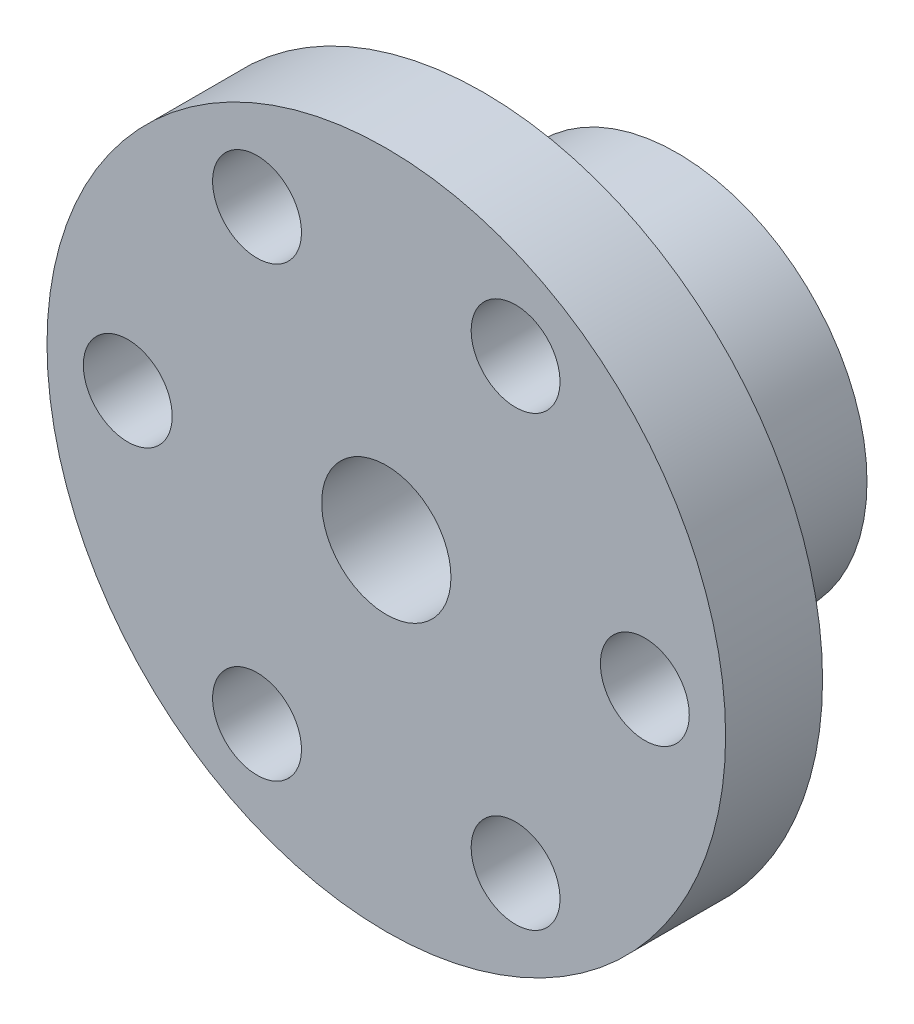
ISO-10303-21;
HEADER;
FILE_DESCRIPTION(('STEP AP214'),'2;1');
FILE_NAME('part.step','',(''),(''),'','','');
FILE_SCHEMA(('AUTOMOTIVE_DESIGN { 1 0 10303 214 1 1 1 1 }'));
ENDSEC;
DATA;
#1=APPLICATION_CONTEXT('core data for automotive mechanical design processes');
#2=APPLICATION_PROTOCOL_DEFINITION('international standard','automotive_design',2000,#1);
#3=PRODUCT_CONTEXT('',#1,'mechanical');
#4=PRODUCT('Part','Part','',(#3));
#5=PRODUCT_RELATED_PRODUCT_CATEGORY('part','',(#4));
#6=PRODUCT_DEFINITION_FORMATION('','',#4);
#7=PRODUCT_DEFINITION_CONTEXT('part definition',#1,'design');
#8=PRODUCT_DEFINITION('design','',#6,#7);
#9=PRODUCT_DEFINITION_SHAPE('','',#8);
#10=(LENGTH_UNIT() NAMED_UNIT(*) SI_UNIT(.MILLI.,.METRE.));
#11=(NAMED_UNIT(*) PLANE_ANGLE_UNIT() SI_UNIT($,.RADIAN.));
#12=(NAMED_UNIT(*) SI_UNIT($,.STERADIAN.) SOLID_ANGLE_UNIT());
#13=UNCERTAINTY_MEASURE_WITH_UNIT(LENGTH_MEASURE(1.E-05),#10,'distance_accuracy_value','');
#14=(GEOMETRIC_REPRESENTATION_CONTEXT(3) GLOBAL_UNCERTAINTY_ASSIGNED_CONTEXT((#13)) GLOBAL_UNIT_ASSIGNED_CONTEXT((#10,
#11,#12)) REPRESENTATION_CONTEXT('',''));
#15=CARTESIAN_POINT('',(0.,0.,0.));
#16=DIRECTION('',(0.,0.,1.));
#17=DIRECTION('',(1.,0.,0.));
#18=AXIS2_PLACEMENT_3D('',#15,#16,#17);
#19=CARTESIAN_POINT('',(0.,0.,3.));
#20=DIRECTION('',(0.,0.,1.));
#21=DIRECTION('',(1.,0.,0.));
#22=AXIS2_PLACEMENT_3D('',#19,#20,#21);
#23=CYLINDRICAL_SURFACE('',#22,11.75);
#24=CARTESIAN_POINT('',(0.,0.,-3.));
#25=DIRECTION('',(0.,0.,1.));
#26=DIRECTION('',(1.,0.,0.));
#27=AXIS2_PLACEMENT_3D('',#24,#25,#26);
#28=CIRCLE('',#27,11.75);
#29=CARTESIAN_POINT('',(11.75,0.,-3.));
#30=VERTEX_POINT('',#29);
#31=EDGE_CURVE('E66',#30,#30,#28,.T.);
#32=ORIENTED_EDGE('',*,*,#31,.F.);
#33=EDGE_LOOP('',(#32));
#34=FACE_BOUND('',#33,.T.);
#35=CARTESIAN_POINT('',(0.,0.,-8.));
#36=DIRECTION('',(0.,0.,-1.));
#37=DIRECTION('',(0.,1.,0.));
#38=AXIS2_PLACEMENT_3D('',#35,#36,#37);
#39=CIRCLE('',#38,11.75);
#40=CARTESIAN_POINT('',(0.,11.75,-8.));
#41=VERTEX_POINT('',#40);
#42=CARTESIAN_POINT('',(0.,-11.75,-8.));
#43=VERTEX_POINT('',#42);
#44=EDGE_CURVE('E11',#41,#43,#39,.T.);
#45=ORIENTED_EDGE('',*,*,#44,.F.);
#46=EDGE_CURVE('E43',#43,#41,#39,.T.);
#47=ORIENTED_EDGE('',*,*,#46,.F.);
#48=EDGE_LOOP('',(#45,#47));
#49=FACE_BOUND('',#48,.T.);
#50=ADVANCED_FACE('F39',(#34,#49),#23,.T.);
#51=CARTESIAN_POINT('',(0.,0.,3.));
#52=DIRECTION('',(0.,0.,-1.));
#53=DIRECTION('',(-1.,0.,0.));
#54=AXIS2_PLACEMENT_3D('',#51,#52,#53);
#55=PLANE('',#54);
#56=CARTESIAN_POINT('',(8.00000000000016,-13.8564064605509,3.));
#57=DIRECTION('',(0.,0.,1.));
#58=DIRECTION('',(0.50000000000001,-0.866025403784433,0.));
#59=AXIS2_PLACEMENT_3D('',#56,#57,#58);
#60=CIRCLE('',#59,2.75);
#61=CARTESIAN_POINT('',(9.37500000000019,-16.2379763209581,3.));
#62=VERTEX_POINT('',#61);
#63=EDGE_CURVE('E111',#62,#62,#60,.T.);
#64=ORIENTED_EDGE('',*,*,#63,.F.);
#65=EDGE_LOOP('',(#64));
#66=FACE_BOUND('',#65,.T.);
#67=CARTESIAN_POINT('',(-7.99999999999987,-13.8564064605511,3.));
#68=DIRECTION('',(0.,0.,1.));
#69=DIRECTION('',(-0.499999999999992,-0.866025403784443,0.));
#70=AXIS2_PLACEMENT_3D('',#67,#68,#69);
#71=CIRCLE('',#70,2.75);
#72=CARTESIAN_POINT('',(-9.37499999999985,-16.2379763209583,3.));
#73=VERTEX_POINT('',#72);
#74=EDGE_CURVE('E105',#73,#73,#71,.T.);
#75=ORIENTED_EDGE('',*,*,#74,.F.);
#76=EDGE_LOOP('',(#75));
#77=FACE_BOUND('',#76,.T.);
#78=CARTESIAN_POINT('',(-16.,0.,3.));
#79=DIRECTION('',(0.,0.,1.));
#80=DIRECTION('',(-1.,0.,0.));
#81=AXIS2_PLACEMENT_3D('',#78,#79,#80);
#82=CIRCLE('',#81,2.75);
#83=CARTESIAN_POINT('',(-18.75,0.,3.));
#84=VERTEX_POINT('',#83);
#85=EDGE_CURVE('E99',#84,#84,#82,.T.);
#86=ORIENTED_EDGE('',*,*,#85,.F.);
#87=EDGE_LOOP('',(#86));
#88=FACE_BOUND('',#87,.T.);
#89=CARTESIAN_POINT('',(-8.00000000000007,13.856406460551,3.));
#90=DIRECTION('',(0.,0.,1.));
#91=DIRECTION('',(-0.500000000000004,0.866025403784436,0.));
#92=AXIS2_PLACEMENT_3D('',#89,#90,#91);
#93=CIRCLE('',#92,2.75);
#94=CARTESIAN_POINT('',(-9.37500000000008,16.2379763209582,3.));
#95=VERTEX_POINT('',#94);
#96=EDGE_CURVE('E93',#95,#95,#93,.T.);
#97=ORIENTED_EDGE('',*,*,#96,.F.);
#98=EDGE_LOOP('',(#97));
#99=FACE_BOUND('',#98,.T.);
#100=CARTESIAN_POINT('',(7.99999999999997,13.856406460551,3.));
#101=DIRECTION('',(0.,0.,1.));
#102=DIRECTION('',(0.499999999999998,0.86602540378444,0.));
#103=AXIS2_PLACEMENT_3D('',#100,#101,#102);
#104=CIRCLE('',#103,2.75);
#105=CARTESIAN_POINT('',(9.37499999999996,16.2379763209582,3.));
#106=VERTEX_POINT('',#105);
#107=EDGE_CURVE('E87',#106,#106,#104,.T.);
#108=ORIENTED_EDGE('',*,*,#107,.F.);
#109=EDGE_LOOP('',(#108));
#110=FACE_BOUND('',#109,.T.);
#111=CARTESIAN_POINT('',(16.,0.,3.));
#112=DIRECTION('',(0.,0.,1.));
#113=DIRECTION('',(1.,0.,0.));
#114=AXIS2_PLACEMENT_3D('',#111,#112,#113);
#115=CIRCLE('',#114,2.75);
#116=CARTESIAN_POINT('',(18.75,0.,3.));
#117=VERTEX_POINT('',#116);
#118=EDGE_CURVE('E81',#117,#117,#115,.T.);
#119=ORIENTED_EDGE('',*,*,#118,.F.);
#120=EDGE_LOOP('',(#119));
#121=FACE_BOUND('',#120,.T.);
#122=CARTESIAN_POINT('',(0.,0.,3.));
#123=DIRECTION('',(0.,0.,1.));
#124=DIRECTION('',(1.,0.,0.));
#125=AXIS2_PLACEMENT_3D('',#122,#123,#124);
#126=CIRCLE('',#125,4.);
#127=CARTESIAN_POINT('',(4.,0.,3.));
#128=VERTEX_POINT('',#127);
#129=EDGE_CURVE('E77',#128,#128,#126,.T.);
#130=ORIENTED_EDGE('',*,*,#129,.F.);
#131=EDGE_LOOP('',(#130));
#132=FACE_BOUND('',#131,.T.);
#133=CARTESIAN_POINT('',(0.,0.,3.));
#134=DIRECTION('',(0.,0.,1.));
#135=DIRECTION('',(1.,0.,0.));
#136=AXIS2_PLACEMENT_3D('',#133,#134,#135);
#137=CIRCLE('',#136,21.);
#138=CARTESIAN_POINT('',(21.,0.,3.));
#139=VERTEX_POINT('',#138);
#140=EDGE_CURVE('E58',#139,#139,#137,.T.);
#141=ORIENTED_EDGE('',*,*,#140,.T.);
#142=EDGE_LOOP('',(#141));
#143=FACE_BOUND('',#142,.T.);
#144=ADVANCED_FACE('F41',(#66,#77,#88,#99,#110,#121,#132,#143),#55,.F.);
#145=CARTESIAN_POINT('',(0.,0.,3.));
#146=DIRECTION('',(0.,0.,1.));
#147=DIRECTION('',(1.,0.,0.));
#148=AXIS2_PLACEMENT_3D('',#145,#146,#147);
#149=CYLINDRICAL_SURFACE('',#148,21.);
#150=ORIENTED_EDGE('',*,*,#140,.F.);
#151=EDGE_LOOP('',(#150));
#152=FACE_BOUND('',#151,.T.);
#153=CARTESIAN_POINT('',(0.,0.,-3.));
#154=DIRECTION('',(0.,0.,1.));
#155=DIRECTION('',(1.,0.,0.));
#156=AXIS2_PLACEMENT_3D('',#153,#154,#155);
#157=CIRCLE('',#156,21.);
#158=CARTESIAN_POINT('',(21.,0.,-3.));
#159=VERTEX_POINT('',#158);
#160=EDGE_CURVE('E62',#159,#159,#157,.T.);
#161=ORIENTED_EDGE('',*,*,#160,.T.);
#162=EDGE_LOOP('',(#161));
#163=FACE_BOUND('',#162,.T.);
#164=ADVANCED_FACE('F129',(#152,#163),#149,.T.);
#165=CARTESIAN_POINT('',(0.,21.,-3.));
#166=DIRECTION('',(0.,0.,1.));
#167=DIRECTION('',(1.,0.,0.));
#168=AXIS2_PLACEMENT_3D('',#165,#166,#167);
#169=PLANE('',#168);
#170=CARTESIAN_POINT('',(8.00000000000016,-13.8564064605509,-3.));
#171=DIRECTION('',(0.,0.,1.));
#172=DIRECTION('',(0.50000000000001,-0.866025403784433,0.));
#173=AXIS2_PLACEMENT_3D('',#170,#171,#172);
#174=CIRCLE('',#173,2.75);
#175=CARTESIAN_POINT('',(9.37500000000019,-16.2379763209581,-3.));
#176=VERTEX_POINT('',#175);
#177=EDGE_CURVE('E108',#176,#176,#174,.T.);
#178=ORIENTED_EDGE('',*,*,#177,.T.);
#179=EDGE_LOOP('',(#178));
#180=FACE_BOUND('',#179,.T.);
#181=CARTESIAN_POINT('',(-7.99999999999987,-13.8564064605511,-3.));
#182=DIRECTION('',(0.,0.,1.));
#183=DIRECTION('',(-0.499999999999992,-0.866025403784443,0.));
#184=AXIS2_PLACEMENT_3D('',#181,#182,#183);
#185=CIRCLE('',#184,2.75);
#186=CARTESIAN_POINT('',(-9.37499999999985,-16.2379763209583,-3.));
#187=VERTEX_POINT('',#186);
#188=EDGE_CURVE('E102',#187,#187,#185,.T.);
#189=ORIENTED_EDGE('',*,*,#188,.T.);
#190=EDGE_LOOP('',(#189));
#191=FACE_BOUND('',#190,.T.);
#192=CARTESIAN_POINT('',(-16.,0.,-3.));
#193=DIRECTION('',(0.,0.,1.));
#194=DIRECTION('',(-1.,0.,0.));
#195=AXIS2_PLACEMENT_3D('',#192,#193,#194);
#196=CIRCLE('',#195,2.75);
#197=CARTESIAN_POINT('',(-18.75,0.,-3.));
#198=VERTEX_POINT('',#197);
#199=EDGE_CURVE('E96',#198,#198,#196,.T.);
#200=ORIENTED_EDGE('',*,*,#199,.T.);
#201=EDGE_LOOP('',(#200));
#202=FACE_BOUND('',#201,.T.);
#203=CARTESIAN_POINT('',(-8.00000000000007,13.856406460551,-3.));
#204=DIRECTION('',(0.,0.,1.));
#205=DIRECTION('',(-0.500000000000004,0.866025403784436,0.));
#206=AXIS2_PLACEMENT_3D('',#203,#204,#205);
#207=CIRCLE('',#206,2.75);
#208=CARTESIAN_POINT('',(-9.37500000000008,16.2379763209582,-3.));
#209=VERTEX_POINT('',#208);
#210=EDGE_CURVE('E90',#209,#209,#207,.T.);
#211=ORIENTED_EDGE('',*,*,#210,.T.);
#212=EDGE_LOOP('',(#211));
#213=FACE_BOUND('',#212,.T.);
#214=CARTESIAN_POINT('',(7.99999999999997,13.856406460551,-3.));
#215=DIRECTION('',(0.,0.,1.));
#216=DIRECTION('',(0.499999999999998,0.86602540378444,0.));
#217=AXIS2_PLACEMENT_3D('',#214,#215,#216);
#218=CIRCLE('',#217,2.75);
#219=CARTESIAN_POINT('',(9.37499999999996,16.2379763209582,-3.));
#220=VERTEX_POINT('',#219);
#221=EDGE_CURVE('E84',#220,#220,#218,.T.);
#222=ORIENTED_EDGE('',*,*,#221,.T.);
#223=EDGE_LOOP('',(#222));
#224=FACE_BOUND('',#223,.T.);
#225=CARTESIAN_POINT('',(16.,0.,-3.));
#226=DIRECTION('',(0.,0.,1.));
#227=DIRECTION('',(1.,0.,0.));
#228=AXIS2_PLACEMENT_3D('',#225,#226,#227);
#229=CIRCLE('',#228,2.75);
#230=CARTESIAN_POINT('',(18.75,0.,-3.));
#231=VERTEX_POINT('',#230);
#232=EDGE_CURVE('E80',#231,#231,#229,.T.);
#233=ORIENTED_EDGE('',*,*,#232,.T.);
#234=EDGE_LOOP('',(#233));
#235=FACE_BOUND('',#234,.T.);
#236=ORIENTED_EDGE('',*,*,#160,.F.);
#237=EDGE_LOOP('',(#236));
#238=FACE_BOUND('',#237,.T.);
#239=ORIENTED_EDGE('',*,*,#31,.T.);
#240=EDGE_LOOP('',(#239));
#241=FACE_BOUND('',#240,.T.);
#242=ADVANCED_FACE('F117',(#180,#191,#202,#213,#224,#235,#238,#241),#169,.F.);
#243=ORIENTED_EDGE('',*,*,#46,.T.);
#244=ORIENTED_EDGE('',*,*,#44,.T.);
#245=EDGE_LOOP('',(#243,#244));
#246=FACE_BOUND('',#245,.T.);
#247=CARTESIAN_POINT('',(0.,0.,-15.));
#248=DIRECTION('',(0.,0.,1.));
#249=DIRECTION('',(1.,0.,0.));
#250=AXIS2_PLACEMENT_3D('',#247,#248,#249);
#251=CIRCLE('',#250,11.75);
#252=CARTESIAN_POINT('',(11.75,0.,-15.));
#253=VERTEX_POINT('',#252);
#254=EDGE_CURVE('E71',#253,#253,#251,.T.);
#255=ORIENTED_EDGE('',*,*,#254,.T.);
#256=EDGE_LOOP('',(#255));
#257=FACE_BOUND('',#256,.T.);
#258=ADVANCED_FACE('F55',(#246,#257),#23,.T.);
#259=CARTESIAN_POINT('',(0.,11.75,-15.));
#260=DIRECTION('',(0.,0.,1.));
#261=DIRECTION('',(1.,0.,0.));
#262=AXIS2_PLACEMENT_3D('',#259,#260,#261);
#263=PLANE('',#262);
#264=CARTESIAN_POINT('',(0.,0.,-15.));
#265=DIRECTION('',(0.,0.,1.));
#266=DIRECTION('',(1.,0.,0.));
#267=AXIS2_PLACEMENT_3D('',#264,#265,#266);
#268=CIRCLE('',#267,4.);
#269=CARTESIAN_POINT('',(4.,0.,-15.));
#270=VERTEX_POINT('',#269);
#271=EDGE_CURVE('E74',#270,#270,#268,.T.);
#272=ORIENTED_EDGE('',*,*,#271,.T.);
#273=EDGE_LOOP('',(#272));
#274=FACE_BOUND('',#273,.T.);
#275=ORIENTED_EDGE('',*,*,#254,.F.);
#276=EDGE_LOOP('',(#275));
#277=FACE_BOUND('',#276,.T.);
#278=ADVANCED_FACE('F145',(#274,#277),#263,.F.);
#279=CARTESIAN_POINT('',(0.,0.,-15.));
#280=DIRECTION('',(0.,0.,1.));
#281=DIRECTION('',(1.,0.,0.));
#282=AXIS2_PLACEMENT_3D('',#279,#280,#281);
#283=CYLINDRICAL_SURFACE('',#282,4.);
#284=ORIENTED_EDGE('',*,*,#271,.F.);
#285=EDGE_LOOP('',(#284));
#286=FACE_BOUND('',#285,.T.);
#287=ORIENTED_EDGE('',*,*,#129,.T.);
#288=EDGE_LOOP('',(#287));
#289=FACE_BOUND('',#288,.T.);
#290=ADVANCED_FACE('F142',(#286,#289),#283,.F.);
#291=CARTESIAN_POINT('',(16.,0.,-3.));
#292=DIRECTION('',(0.,0.,1.));
#293=DIRECTION('',(1.,0.,0.));
#294=AXIS2_PLACEMENT_3D('',#291,#292,#293);
#295=CYLINDRICAL_SURFACE('',#294,2.75);
#296=ORIENTED_EDGE('',*,*,#232,.F.);
#297=EDGE_LOOP('',(#296));
#298=FACE_BOUND('',#297,.T.);
#299=ORIENTED_EDGE('',*,*,#118,.T.);
#300=EDGE_LOOP('',(#299));
#301=FACE_BOUND('',#300,.T.);
#302=ADVANCED_FACE('F144',(#298,#301),#295,.F.);
#303=CARTESIAN_POINT('',(7.99999999999997,13.856406460551,-3.));
#304=DIRECTION('',(0.,0.,1.));
#305=DIRECTION('',(1.,0.,0.));
#306=AXIS2_PLACEMENT_3D('',#303,#304,#305);
#307=CYLINDRICAL_SURFACE('',#306,2.75);
#308=ORIENTED_EDGE('',*,*,#221,.F.);
#309=EDGE_LOOP('',(#308));
#310=FACE_BOUND('',#309,.T.);
#311=ORIENTED_EDGE('',*,*,#107,.T.);
#312=EDGE_LOOP('',(#311));
#313=FACE_BOUND('',#312,.T.);
#314=ADVANCED_FACE('F152',(#310,#313),#307,.F.);
#315=CARTESIAN_POINT('',(-8.00000000000007,13.856406460551,-3.));
#316=DIRECTION('',(0.,0.,1.));
#317=DIRECTION('',(1.,0.,0.));
#318=AXIS2_PLACEMENT_3D('',#315,#316,#317);
#319=CYLINDRICAL_SURFACE('',#318,2.75);
#320=ORIENTED_EDGE('',*,*,#210,.F.);
#321=EDGE_LOOP('',(#320));
#322=FACE_BOUND('',#321,.T.);
#323=ORIENTED_EDGE('',*,*,#96,.T.);
#324=EDGE_LOOP('',(#323));
#325=FACE_BOUND('',#324,.T.);
#326=ADVANCED_FACE('F201',(#322,#325),#319,.F.);
#327=CARTESIAN_POINT('',(-16.,0.,-3.));
#328=DIRECTION('',(0.,0.,1.));
#329=DIRECTION('',(1.,0.,0.));
#330=AXIS2_PLACEMENT_3D('',#327,#328,#329);
#331=CYLINDRICAL_SURFACE('',#330,2.75);
#332=ORIENTED_EDGE('',*,*,#199,.F.);
#333=EDGE_LOOP('',(#332));
#334=FACE_BOUND('',#333,.T.);
#335=ORIENTED_EDGE('',*,*,#85,.T.);
#336=EDGE_LOOP('',(#335));
#337=FACE_BOUND('',#336,.T.);
#338=ADVANCED_FACE('F211',(#334,#337),#331,.F.);
#339=CARTESIAN_POINT('',(-7.99999999999987,-13.8564064605511,-3.));
#340=DIRECTION('',(0.,0.,1.));
#341=DIRECTION('',(1.,0.,0.));
#342=AXIS2_PLACEMENT_3D('',#339,#340,#341);
#343=CYLINDRICAL_SURFACE('',#342,2.75);
#344=ORIENTED_EDGE('',*,*,#188,.F.);
#345=EDGE_LOOP('',(#344));
#346=FACE_BOUND('',#345,.T.);
#347=ORIENTED_EDGE('',*,*,#74,.T.);
#348=EDGE_LOOP('',(#347));
#349=FACE_BOUND('',#348,.T.);
#350=ADVANCED_FACE('F123',(#346,#349),#343,.F.);
#351=CARTESIAN_POINT('',(8.00000000000016,-13.8564064605509,-3.));
#352=DIRECTION('',(0.,0.,1.));
#353=DIRECTION('',(1.,0.,0.));
#354=AXIS2_PLACEMENT_3D('',#351,#352,#353);
#355=CYLINDRICAL_SURFACE('',#354,2.75);
#356=ORIENTED_EDGE('',*,*,#177,.F.);
#357=EDGE_LOOP('',(#356));
#358=FACE_BOUND('',#357,.T.);
#359=ORIENTED_EDGE('',*,*,#63,.T.);
#360=EDGE_LOOP('',(#359));
#361=FACE_BOUND('',#360,.T.);
#362=ADVANCED_FACE('F120',(#358,#361),#355,.F.);
#363=CLOSED_SHELL('',(#50,#144,#164,#242,#258,#278,#290,#302,#314,#326,#338,#350,#362));
#364=MANIFOLD_SOLID_BREP('B2',#363);
#365=ADVANCED_BREP_SHAPE_REPRESENTATION('',(#18,#364),#14);
#366=SHAPE_DEFINITION_REPRESENTATION(#9,#365);
ENDSEC;
END-ISO-10303-21;
